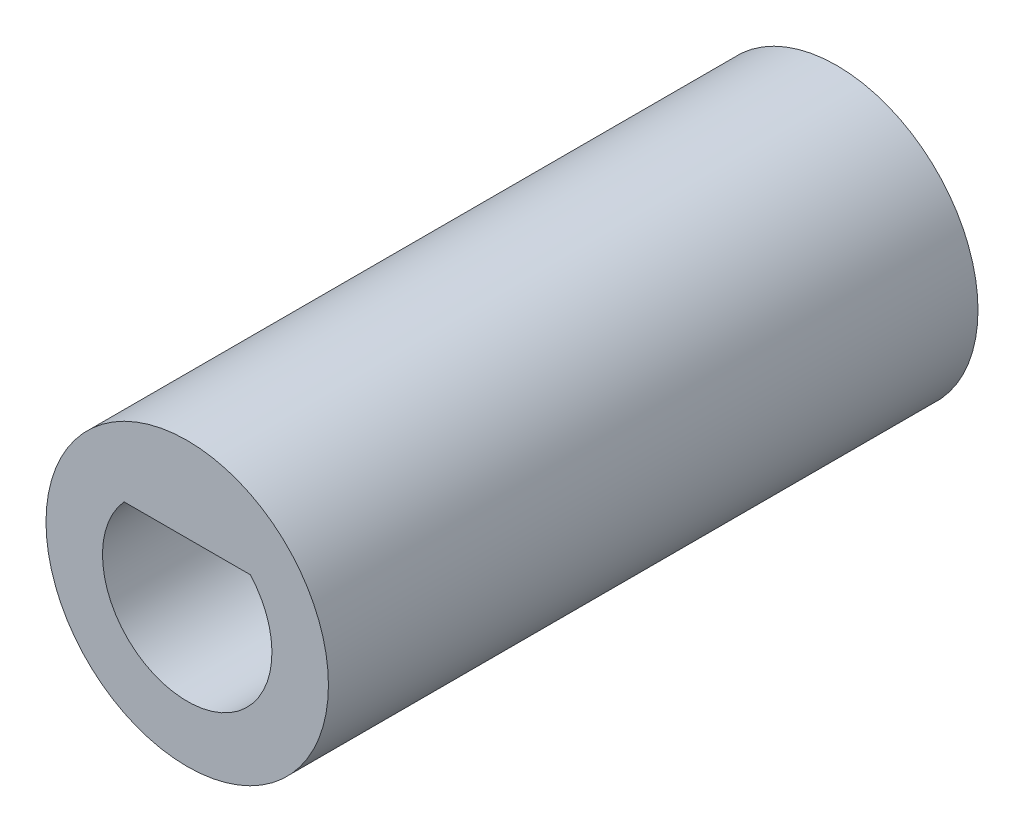
ISO-10303-21;
HEADER;
FILE_DESCRIPTION(('STEP AP214'),'2;1');
FILE_NAME('part.step','',(''),(''),'','','');
FILE_SCHEMA(('AUTOMOTIVE_DESIGN { 1 0 10303 214 1 1 1 1 }'));
ENDSEC;
DATA;
#1=APPLICATION_CONTEXT('core data for automotive mechanical design processes');
#2=APPLICATION_PROTOCOL_DEFINITION('international standard','automotive_design',2000,#1);
#3=PRODUCT_CONTEXT('',#1,'mechanical');
#4=PRODUCT('Part','Part','',(#3));
#5=PRODUCT_RELATED_PRODUCT_CATEGORY('part','',(#4));
#6=PRODUCT_DEFINITION_FORMATION('','',#4);
#7=PRODUCT_DEFINITION_CONTEXT('part definition',#1,'design');
#8=PRODUCT_DEFINITION('design','',#6,#7);
#9=PRODUCT_DEFINITION_SHAPE('','',#8);
#10=(LENGTH_UNIT() NAMED_UNIT(*) SI_UNIT(.MILLI.,.METRE.));
#11=(NAMED_UNIT(*) PLANE_ANGLE_UNIT() SI_UNIT($,.RADIAN.));
#12=(NAMED_UNIT(*) SI_UNIT($,.STERADIAN.) SOLID_ANGLE_UNIT());
#13=UNCERTAINTY_MEASURE_WITH_UNIT(LENGTH_MEASURE(1.E-05),#10,'distance_accuracy_value','');
#14=(GEOMETRIC_REPRESENTATION_CONTEXT(3) GLOBAL_UNCERTAINTY_ASSIGNED_CONTEXT((#13)) GLOBAL_UNIT_ASSIGNED_CONTEXT((#10,
#11,#12)) REPRESENTATION_CONTEXT('',''));
#15=CARTESIAN_POINT('',(0.,0.,0.));
#16=DIRECTION('',(0.,0.,1.));
#17=DIRECTION('',(1.,0.,0.));
#18=AXIS2_PLACEMENT_3D('',#15,#16,#17);
#19=CARTESIAN_POINT('',(0.,0.,23.));
#20=DIRECTION('',(0.,0.,-1.));
#21=DIRECTION('',(-1.,0.,0.));
#22=AXIS2_PLACEMENT_3D('',#19,#20,#21);
#23=CYLINDRICAL_SURFACE('',#22,5.);
#24=CARTESIAN_POINT('',(0.,0.,23.));
#25=DIRECTION('',(0.,0.,1.));
#26=DIRECTION('',(1.,0.,0.));
#27=AXIS2_PLACEMENT_3D('',#24,#25,#26);
#28=CIRCLE('',#27,5.);
#29=CARTESIAN_POINT('',(5.,0.,23.));
#30=VERTEX_POINT('',#29);
#31=EDGE_CURVE('E11',#30,#30,#28,.T.);
#32=ORIENTED_EDGE('',*,*,#31,.F.);
#33=EDGE_LOOP('',(#32));
#34=FACE_BOUND('',#33,.T.);
#35=CARTESIAN_POINT('',(0.,0.,0.));
#36=DIRECTION('',(0.,0.,1.));
#37=DIRECTION('',(1.,0.,0.));
#38=AXIS2_PLACEMENT_3D('',#35,#36,#37);
#39=CIRCLE('',#38,5.);
#40=CARTESIAN_POINT('',(5.,0.,0.));
#41=VERTEX_POINT('',#40);
#42=EDGE_CURVE('E38',#41,#41,#39,.T.);
#43=ORIENTED_EDGE('',*,*,#42,.T.);
#44=EDGE_LOOP('',(#43));
#45=FACE_BOUND('',#44,.T.);
#46=ADVANCED_FACE('F35',(#34,#45),#23,.T.);
#47=CARTESIAN_POINT('',(0.,0.,23.));
#48=DIRECTION('',(0.,0.,1.));
#49=DIRECTION('',(1.,0.,0.));
#50=AXIS2_PLACEMENT_3D('',#47,#48,#49);
#51=PLANE('',#50);
#52=CARTESIAN_POINT('',(0.,0.,23.));
#53=DIRECTION('',(0.,0.,1.));
#54=DIRECTION('',(1.,0.,0.));
#55=AXIS2_PLACEMENT_3D('',#52,#53,#54);
#56=CIRCLE('',#55,3.);
#57=CARTESIAN_POINT('',(-2.23606797749979,2.,23.));
#58=VERTEX_POINT('',#57);
#59=CARTESIAN_POINT('',(2.23606797749979,2.,23.));
#60=VERTEX_POINT('',#59);
#61=EDGE_CURVE('E49',#58,#60,#56,.T.);
#62=ORIENTED_EDGE('',*,*,#61,.F.);
#63=DIRECTION('',(-1.,0.,0.));
#64=VECTOR('',#63,1.);
#65=CARTESIAN_POINT('',(-2.23606797749979,2.,23.));
#66=LINE('',#65,#64);
#67=EDGE_CURVE('E71',#60,#58,#66,.T.);
#68=ORIENTED_EDGE('',*,*,#67,.F.);
#69=EDGE_LOOP('',(#62,#68));
#70=FACE_BOUND('',#69,.T.);
#71=ORIENTED_EDGE('',*,*,#31,.T.);
#72=EDGE_LOOP('',(#71));
#73=FACE_BOUND('',#72,.T.);
#74=ADVANCED_FACE('F83',(#70,#73),#51,.T.);
#75=CARTESIAN_POINT('',(0.,0.,0.));
#76=DIRECTION('',(0.,0.,1.));
#77=DIRECTION('',(1.,0.,0.));
#78=AXIS2_PLACEMENT_3D('',#75,#76,#77);
#79=PLANE('',#78);
#80=CARTESIAN_POINT('',(0.,0.,0.));
#81=DIRECTION('',(0.,0.,-1.));
#82=DIRECTION('',(-1.,0.,0.));
#83=AXIS2_PLACEMENT_3D('',#80,#81,#82);
#84=CIRCLE('',#83,4.);
#85=CARTESIAN_POINT('',(-4.,0.,0.));
#86=VERTEX_POINT('',#85);
#87=EDGE_CURVE('E77',#86,#86,#84,.T.);
#88=ORIENTED_EDGE('',*,*,#87,.F.);
#89=EDGE_LOOP('',(#88));
#90=FACE_BOUND('',#89,.T.);
#91=ORIENTED_EDGE('',*,*,#42,.F.);
#92=EDGE_LOOP('',(#91));
#93=FACE_BOUND('',#92,.T.);
#94=ADVANCED_FACE('F86',(#90,#93),#79,.F.);
#95=CARTESIAN_POINT('',(0.,0.,13.));
#96=DIRECTION('',(0.,0.,1.));
#97=DIRECTION('',(1.,0.,0.));
#98=AXIS2_PLACEMENT_3D('',#95,#96,#97);
#99=CYLINDRICAL_SURFACE('',#98,3.);
#100=ORIENTED_EDGE('',*,*,#61,.T.);
#101=DIRECTION('',(0.,0.,1.));
#102=VECTOR('',#101,1.);
#103=CARTESIAN_POINT('',(2.23606797749979,2.,13.));
#104=LINE('',#103,#102);
#105=CARTESIAN_POINT('',(2.23606797749979,2.,13.));
#106=VERTEX_POINT('',#105);
#107=EDGE_CURVE('E65',#106,#60,#104,.T.);
#108=ORIENTED_EDGE('',*,*,#107,.F.);
#109=CARTESIAN_POINT('',(0.,0.,13.));
#110=DIRECTION('',(0.,0.,1.));
#111=DIRECTION('',(1.,0.,0.));
#112=AXIS2_PLACEMENT_3D('',#109,#110,#111);
#113=CIRCLE('',#112,3.);
#114=CARTESIAN_POINT('',(-2.23606797749979,2.,13.));
#115=VERTEX_POINT('',#114);
#116=EDGE_CURVE('E57',#115,#106,#113,.T.);
#117=ORIENTED_EDGE('',*,*,#116,.F.);
#118=DIRECTION('',(0.,0.,1.));
#119=VECTOR('',#118,1.);
#120=CARTESIAN_POINT('',(-2.23606797749979,2.,13.));
#121=LINE('',#120,#119);
#122=EDGE_CURVE('E68',#115,#58,#121,.T.);
#123=ORIENTED_EDGE('',*,*,#122,.T.);
#124=EDGE_LOOP('',(#100,#108,#117,#123));
#125=FACE_BOUND('',#124,.T.);
#126=ADVANCED_FACE('F73',(#125),#99,.F.);
#127=CARTESIAN_POINT('',(-2.23606797749979,2.,13.));
#128=DIRECTION('',(0.,1.,0.));
#129=DIRECTION('',(0.,0.,1.));
#130=AXIS2_PLACEMENT_3D('',#127,#128,#129);
#131=PLANE('',#130);
#132=ORIENTED_EDGE('',*,*,#67,.T.);
#133=ORIENTED_EDGE('',*,*,#122,.F.);
#134=DIRECTION('',(-1.,0.,0.));
#135=VECTOR('',#134,1.);
#136=CARTESIAN_POINT('',(-2.23606797749979,2.,13.));
#137=LINE('',#136,#135);
#138=EDGE_CURVE('E61',#106,#115,#137,.T.);
#139=ORIENTED_EDGE('',*,*,#138,.F.);
#140=ORIENTED_EDGE('',*,*,#107,.T.);
#141=EDGE_LOOP('',(#132,#133,#139,#140));
#142=FACE_BOUND('',#141,.T.);
#143=ADVANCED_FACE('F69',(#142),#131,.F.);
#144=CARTESIAN_POINT('',(0.,0.,13.));
#145=DIRECTION('',(0.,0.,-1.));
#146=DIRECTION('',(-1.,0.,0.));
#147=AXIS2_PLACEMENT_3D('',#144,#145,#146);
#148=PLANE('',#147);
#149=CARTESIAN_POINT('',(0.,0.,13.));
#150=DIRECTION('',(0.,0.,-1.));
#151=DIRECTION('',(-1.,0.,0.));
#152=AXIS2_PLACEMENT_3D('',#149,#150,#151);
#153=CIRCLE('',#152,4.);
#154=CARTESIAN_POINT('',(-4.,0.,13.));
#155=VERTEX_POINT('',#154);
#156=EDGE_CURVE('E80',#155,#155,#153,.T.);
#157=ORIENTED_EDGE('',*,*,#156,.T.);
#158=EDGE_LOOP('',(#157));
#159=FACE_BOUND('',#158,.T.);
#160=ORIENTED_EDGE('',*,*,#116,.T.);
#161=ORIENTED_EDGE('',*,*,#138,.T.);
#162=EDGE_LOOP('',(#160,#161));
#163=FACE_BOUND('',#162,.T.);
#164=ADVANCED_FACE('F63',(#159,#163),#148,.T.);
#165=CARTESIAN_POINT('',(0.,0.,13.));
#166=DIRECTION('',(0.,0.,-1.));
#167=DIRECTION('',(-1.,0.,0.));
#168=AXIS2_PLACEMENT_3D('',#165,#166,#167);
#169=CYLINDRICAL_SURFACE('',#168,4.);
#170=CARTESIAN_POINT('',(-4.,0.,13.));
#171=CARTESIAN_POINT('',(-4.,0.,12.8645833333333));
#172=CARTESIAN_POINT('',(-4.,0.,12.7291666666667));
#173=CARTESIAN_POINT('',(-4.,0.,12.4583333333333));
#174=CARTESIAN_POINT('',(-4.,0.,12.3229166666667));
#175=CARTESIAN_POINT('',(-4.,0.,12.0520833333333));
#176=CARTESIAN_POINT('',(-4.,0.,11.9166666666667));
#177=CARTESIAN_POINT('',(-4.,0.,11.6458333333333));
#178=CARTESIAN_POINT('',(-4.,0.,11.5104166666667));
#179=CARTESIAN_POINT('',(-4.,0.,11.2395833333333));
#180=CARTESIAN_POINT('',(-4.,0.,11.1041666666667));
#181=CARTESIAN_POINT('',(-4.,0.,10.8333333333333));
#182=CARTESIAN_POINT('',(-4.,0.,10.6979166666667));
#183=CARTESIAN_POINT('',(-4.,0.,10.4270833333333));
#184=CARTESIAN_POINT('',(-4.,0.,10.2916666666667));
#185=CARTESIAN_POINT('',(-4.,0.,10.0208333333333));
#186=CARTESIAN_POINT('',(-4.,0.,9.88541666666667));
#187=CARTESIAN_POINT('',(-4.,0.,9.61458333333333));
#188=CARTESIAN_POINT('',(-4.,0.,9.47916666666667));
#189=CARTESIAN_POINT('',(-4.,0.,9.20833333333333));
#190=CARTESIAN_POINT('',(-4.,0.,9.07291666666667));
#191=CARTESIAN_POINT('',(-4.,0.,8.80208333333333));
#192=CARTESIAN_POINT('',(-4.,0.,8.66666666666667));
#193=CARTESIAN_POINT('',(-4.,0.,8.39583333333333));
#194=CARTESIAN_POINT('',(-4.,0.,8.26041666666667));
#195=CARTESIAN_POINT('',(-4.,0.,7.98958333333333));
#196=CARTESIAN_POINT('',(-4.,0.,7.85416666666667));
#197=CARTESIAN_POINT('',(-4.,0.,7.58333333333333));
#198=CARTESIAN_POINT('',(-4.,0.,7.44791666666667));
#199=CARTESIAN_POINT('',(-4.,0.,7.17708333333333));
#200=CARTESIAN_POINT('',(-4.,0.,7.04166666666667));
#201=CARTESIAN_POINT('',(-4.,0.,6.77083333333333));
#202=CARTESIAN_POINT('',(-4.,0.,6.63541666666667));
#203=CARTESIAN_POINT('',(-4.,0.,6.36458333333333));
#204=CARTESIAN_POINT('',(-4.,0.,6.22916666666667));
#205=CARTESIAN_POINT('',(-4.,0.,5.95833333333333));
#206=CARTESIAN_POINT('',(-4.,0.,5.82291666666667));
#207=CARTESIAN_POINT('',(-4.,0.,5.55208333333333));
#208=CARTESIAN_POINT('',(-4.,0.,5.41666666666667));
#209=CARTESIAN_POINT('',(-4.,0.,5.14583333333333));
#210=CARTESIAN_POINT('',(-4.,0.,5.01041666666667));
#211=CARTESIAN_POINT('',(-4.,0.,4.73958333333333));
#212=CARTESIAN_POINT('',(-4.,0.,4.60416666666667));
#213=CARTESIAN_POINT('',(-4.,0.,4.33333333333333));
#214=CARTESIAN_POINT('',(-4.,0.,4.19791666666667));
#215=CARTESIAN_POINT('',(-4.,0.,3.92708333333333));
#216=CARTESIAN_POINT('',(-4.,0.,3.79166666666667));
#217=CARTESIAN_POINT('',(-4.,0.,3.52083333333333));
#218=CARTESIAN_POINT('',(-4.,0.,3.38541666666667));
#219=CARTESIAN_POINT('',(-4.,0.,3.11458333333333));
#220=CARTESIAN_POINT('',(-4.,0.,2.97916666666667));
#221=CARTESIAN_POINT('',(-4.,0.,2.70833333333333));
#222=CARTESIAN_POINT('',(-4.,0.,2.57291666666667));
#223=CARTESIAN_POINT('',(-4.,0.,2.30208333333333));
#224=CARTESIAN_POINT('',(-4.,0.,2.16666666666667));
#225=CARTESIAN_POINT('',(-4.,0.,1.89583333333333));
#226=CARTESIAN_POINT('',(-4.,0.,1.76041666666667));
#227=CARTESIAN_POINT('',(-4.,0.,1.48958333333333));
#228=CARTESIAN_POINT('',(-4.,0.,1.35416666666667));
#229=CARTESIAN_POINT('',(-4.,0.,1.08333333333333));
#230=CARTESIAN_POINT('',(-4.,0.,0.947916666666667));
#231=CARTESIAN_POINT('',(-4.,0.,0.677083333333334));
#232=CARTESIAN_POINT('',(-4.,0.,0.541666666666667));
#233=CARTESIAN_POINT('',(-4.,0.,0.270833333333334));
#234=CARTESIAN_POINT('',(-4.,0.,0.135416666666667));
#235=CARTESIAN_POINT('',(-4.,0.,0.));
#236=B_SPLINE_CURVE_WITH_KNOTS('',3,(#170,#171,#172,#173,#174,#175,#176,#177,#178,#179,#180,
#181,#182,#183,#184,#185,#186,#187,#188,#189,#190,#191,#192,#193,#194,#195,#196,#197,#198,#199,
#200,#201,#202,#203,#204,#205,#206,#207,#208,#209,#210,#211,#212,#213,#214,#215,#216,#217,#218,
#219,#220,#221,#222,#223,#224,#225,#226,#227,#228,#229,#230,#231,#232,#233,#234,#235),
.UNSPECIFIED.,.F.,.F.,(4,2,2,2,2,2,2,2,2,2,2,2,2,2,2,2,2,2,2,2,2,2,2,2,2,2,2,2,2,2,2,2,4),(0.,
0.406249999999999,0.812499999999999,1.21875,1.625,2.03125,2.4375,2.84375,3.25,3.65625,4.0625,
4.46875,4.875,5.28125,5.6875,6.09375,6.5,6.90625,7.3125,7.71875,8.125,8.53125,8.9375,9.34375,
9.75,10.15625,10.5625,10.96875,11.375,11.78125,12.1875,12.59375,13.),.UNSPECIFIED.);
#237=EDGE_CURVE('BSEAM105',#155,#86,#236,.T.);
#238=ORIENTED_EDGE('',*,*,#156,.F.);
#239=ORIENTED_EDGE('',*,*,#87,.T.);
#240=ORIENTED_EDGE('',*,*,#237,.T.);
#241=ORIENTED_EDGE('',*,*,#237,.F.);
#242=EDGE_LOOP('',(#238,#240,#239,#241));
#243=FACE_BOUND('',#242,.T.);
#244=ADVANCED_FACE('F105',(#243),#169,.F.);
#245=CLOSED_SHELL('',(#46,#74,#94,#126,#143,#164,#244));
#246=MANIFOLD_SOLID_BREP('B2',#245);
#247=ADVANCED_BREP_SHAPE_REPRESENTATION('',(#18,#246),#14);
#248=SHAPE_DEFINITION_REPRESENTATION(#9,#247);
ENDSEC;
END-ISO-10303-21;
